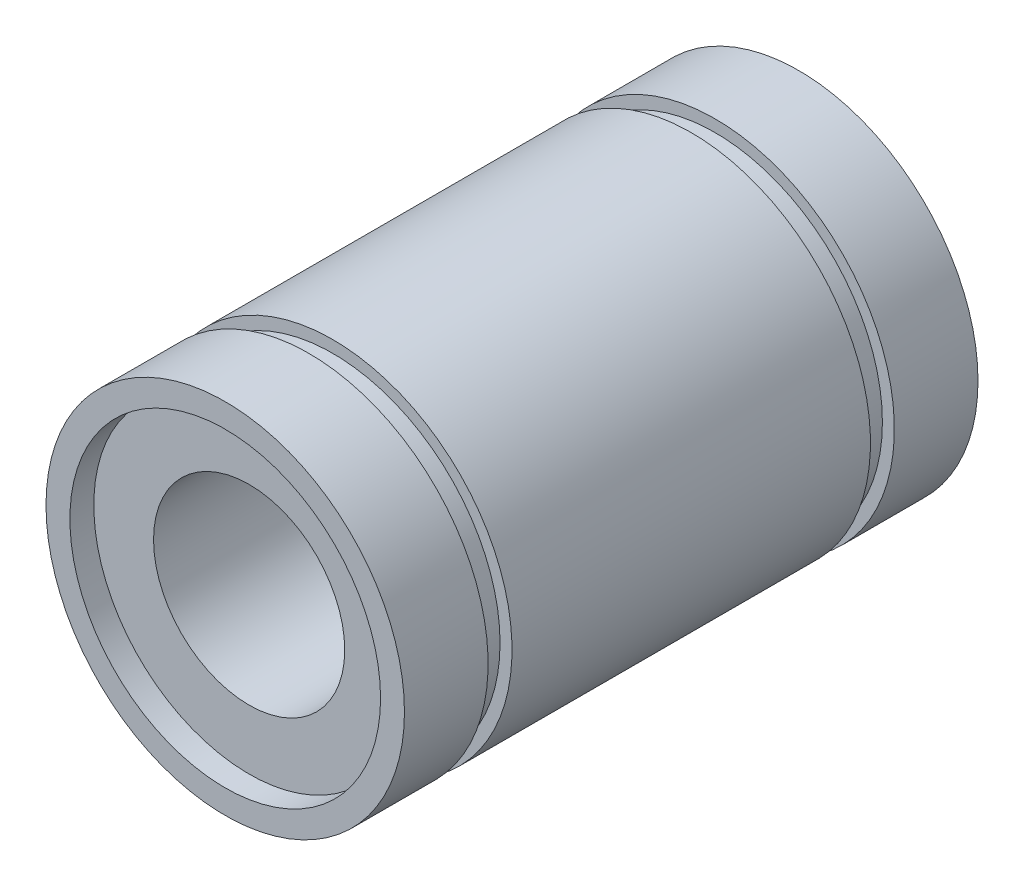
ISO-10303-21;
HEADER;
FILE_DESCRIPTION(('STEP AP214'),'2;1');
FILE_NAME('part.step','',(''),(''),'','','');
FILE_SCHEMA(('AUTOMOTIVE_DESIGN { 1 0 10303 214 1 1 1 1 }'));
ENDSEC;
DATA;
#1=APPLICATION_CONTEXT('core data for automotive mechanical design processes');
#2=APPLICATION_PROTOCOL_DEFINITION('international standard','automotive_design',2000,#1);
#3=PRODUCT_CONTEXT('',#1,'mechanical');
#4=PRODUCT('Part','Part','',(#3));
#5=PRODUCT_RELATED_PRODUCT_CATEGORY('part','',(#4));
#6=PRODUCT_DEFINITION_FORMATION('','',#4);
#7=PRODUCT_DEFINITION_CONTEXT('part definition',#1,'design');
#8=PRODUCT_DEFINITION('design','',#6,#7);
#9=PRODUCT_DEFINITION_SHAPE('','',#8);
#10=(LENGTH_UNIT() NAMED_UNIT(*) SI_UNIT(.MILLI.,.METRE.));
#11=(NAMED_UNIT(*) PLANE_ANGLE_UNIT() SI_UNIT($,.RADIAN.));
#12=(NAMED_UNIT(*) SI_UNIT($,.STERADIAN.) SOLID_ANGLE_UNIT());
#13=UNCERTAINTY_MEASURE_WITH_UNIT(LENGTH_MEASURE(1.E-05),#10,'distance_accuracy_value','');
#14=(GEOMETRIC_REPRESENTATION_CONTEXT(3) GLOBAL_UNCERTAINTY_ASSIGNED_CONTEXT((#13)) GLOBAL_UNIT_ASSIGNED_CONTEXT((#10,
#11,#12)) REPRESENTATION_CONTEXT('',''));
#15=CARTESIAN_POINT('',(0.,0.,0.));
#16=DIRECTION('',(0.,0.,1.));
#17=DIRECTION('',(1.,0.,0.));
#18=AXIS2_PLACEMENT_3D('',#15,#16,#17);
#19=CARTESIAN_POINT('',(0.,0.,11.));
#20=DIRECTION('',(0.,0.,1.));
#21=DIRECTION('',(1.,0.,0.));
#22=AXIS2_PLACEMENT_3D('',#19,#20,#21);
#23=PLANE('',#22);
#24=CARTESIAN_POINT('',(0.,0.,11.));
#25=DIRECTION('',(0.,0.,1.));
#26=DIRECTION('',(1.,0.,0.));
#27=AXIS2_PLACEMENT_3D('',#24,#25,#26);
#28=CIRCLE('',#27,6.5);
#29=CARTESIAN_POINT('',(6.5,0.,11.));
#30=VERTEX_POINT('',#29);
#31=EDGE_CURVE('E11',#30,#30,#28,.T.);
#32=ORIENTED_EDGE('',*,*,#31,.T.);
#33=EDGE_LOOP('',(#32));
#34=FACE_BOUND('',#33,.T.);
#35=CARTESIAN_POINT('',(0.,0.,11.));
#36=DIRECTION('',(0.,0.,1.));
#37=DIRECTION('',(1.,0.,0.));
#38=AXIS2_PLACEMENT_3D('',#35,#36,#37);
#39=CIRCLE('',#38,4.);
#40=CARTESIAN_POINT('',(4.,0.,11.));
#41=VERTEX_POINT('',#40);
#42=EDGE_CURVE('E51',#41,#41,#39,.T.);
#43=ORIENTED_EDGE('',*,*,#42,.F.);
#44=EDGE_LOOP('',(#43));
#45=FACE_BOUND('',#44,.T.);
#46=ADVANCED_FACE('F40',(#34,#45),#23,.T.);
#47=CARTESIAN_POINT('',(0.,0.,-11.));
#48=DIRECTION('',(0.,0.,1.));
#49=DIRECTION('',(1.,0.,0.));
#50=AXIS2_PLACEMENT_3D('',#47,#48,#49);
#51=PLANE('',#50);
#52=CARTESIAN_POINT('',(0.,0.,-11.));
#53=DIRECTION('',(0.,0.,1.));
#54=DIRECTION('',(1.,0.,0.));
#55=AXIS2_PLACEMENT_3D('',#52,#53,#54);
#56=CIRCLE('',#55,6.5);
#57=CARTESIAN_POINT('',(6.5,0.,-11.));
#58=VERTEX_POINT('',#57);
#59=EDGE_CURVE('E44',#58,#58,#56,.T.);
#60=ORIENTED_EDGE('',*,*,#59,.F.);
#61=EDGE_LOOP('',(#60));
#62=FACE_BOUND('',#61,.T.);
#63=CARTESIAN_POINT('',(0.,0.,-11.));
#64=DIRECTION('',(0.,0.,1.));
#65=DIRECTION('',(1.,0.,0.));
#66=AXIS2_PLACEMENT_3D('',#63,#64,#65);
#67=CIRCLE('',#66,4.);
#68=CARTESIAN_POINT('',(4.,0.,-11.));
#69=VERTEX_POINT('',#68);
#70=EDGE_CURVE('E53',#69,#69,#67,.T.);
#71=ORIENTED_EDGE('',*,*,#70,.T.);
#72=EDGE_LOOP('',(#71));
#73=FACE_BOUND('',#72,.T.);
#74=ADVANCED_FACE('F63',(#62,#73),#51,.F.);
#75=CARTESIAN_POINT('',(0.,0.,11.));
#76=DIRECTION('',(0.,0.,-1.));
#77=DIRECTION('',(-1.,0.,0.));
#78=AXIS2_PLACEMENT_3D('',#75,#76,#77);
#79=CYLINDRICAL_SURFACE('',#78,6.5);
#80=ORIENTED_EDGE('',*,*,#31,.F.);
#81=EDGE_LOOP('',(#80));
#82=FACE_BOUND('',#81,.T.);
#83=ORIENTED_EDGE('',*,*,#59,.T.);
#84=EDGE_LOOP('',(#83));
#85=FACE_BOUND('',#84,.T.);
#86=ADVANCED_FACE('F42',(#82,#85),#79,.T.);
#87=CARTESIAN_POINT('',(0.,0.,11.));
#88=DIRECTION('',(0.,0.,-1.));
#89=DIRECTION('',(-1.,0.,0.));
#90=AXIS2_PLACEMENT_3D('',#87,#88,#89);
#91=CYLINDRICAL_SURFACE('',#90,4.);
#92=ORIENTED_EDGE('',*,*,#42,.T.);
#93=EDGE_LOOP('',(#92));
#94=FACE_BOUND('',#93,.T.);
#95=ORIENTED_EDGE('',*,*,#70,.F.);
#96=EDGE_LOOP('',(#95));
#97=FACE_BOUND('',#96,.T.);
#98=ADVANCED_FACE('F59',(#94,#97),#91,.F.);
#99=CLOSED_SHELL('',(#46,#74,#86,#98));
#100=MANIFOLD_SOLID_BREP('B2',#99);
#101=CARTESIAN_POINT('',(0.,0.,12.));
#102=DIRECTION('',(0.,0.,-1.));
#103=DIRECTION('',(-1.,0.,0.));
#104=AXIS2_PLACEMENT_3D('',#101,#102,#103);
#105=CYLINDRICAL_SURFACE('',#104,7.5);
#106=CARTESIAN_POINT('',(0.,0.,12.));
#107=DIRECTION('',(0.,0.,1.));
#108=DIRECTION('',(1.,0.,0.));
#109=AXIS2_PLACEMENT_3D('',#106,#107,#108);
#110=CIRCLE('',#109,7.5);
#111=CARTESIAN_POINT('',(7.5,0.,12.));
#112=VERTEX_POINT('',#111);
#113=EDGE_CURVE('E39',#112,#112,#110,.T.);
#114=ORIENTED_EDGE('',*,*,#113,.F.);
#115=EDGE_LOOP('',(#114));
#116=FACE_BOUND('',#115,.T.);
#117=CARTESIAN_POINT('',(0.,0.,8.5));
#118=DIRECTION('',(0.,0.,-1.));
#119=DIRECTION('',(-1.,0.,0.));
#120=AXIS2_PLACEMENT_3D('',#117,#118,#119);
#121=CIRCLE('',#120,7.5);
#122=CARTESIAN_POINT('',(-7.5,0.,8.5));
#123=VERTEX_POINT('',#122);
#124=EDGE_CURVE('E139',#123,#123,#121,.T.);
#125=ORIENTED_EDGE('',*,*,#124,.F.);
#126=EDGE_LOOP('',(#125));
#127=FACE_BOUND('',#126,.T.);
#128=ADVANCED_FACE('F101',(#116,#127),#105,.T.);
#129=CARTESIAN_POINT('',(0.,0.,-7.5));
#130=DIRECTION('',(0.,0.,-1.));
#131=DIRECTION('',(-1.,0.,0.));
#132=AXIS2_PLACEMENT_3D('',#129,#130,#131);
#133=CIRCLE('',#132,7.5);
#134=CARTESIAN_POINT('',(-7.5,0.,-7.5));
#135=VERTEX_POINT('',#134);
#136=EDGE_CURVE('E116',#135,#135,#133,.T.);
#137=ORIENTED_EDGE('',*,*,#136,.F.);
#138=EDGE_LOOP('',(#137));
#139=FACE_BOUND('',#138,.T.);
#140=CARTESIAN_POINT('',(0.,0.,7.5));
#141=DIRECTION('',(0.,0.,-1.));
#142=DIRECTION('',(-1.,0.,0.));
#143=AXIS2_PLACEMENT_3D('',#140,#141,#142);
#144=CIRCLE('',#143,7.5);
#145=CARTESIAN_POINT('',(-7.5,0.,7.5));
#146=VERTEX_POINT('',#145);
#147=EDGE_CURVE('E136',#146,#146,#144,.T.);
#148=ORIENTED_EDGE('',*,*,#147,.T.);
#149=EDGE_LOOP('',(#148));
#150=FACE_BOUND('',#149,.T.);
#151=ADVANCED_FACE('F147',(#139,#150),#105,.T.);
#152=CARTESIAN_POINT('',(0.,0.,-12.));
#153=DIRECTION('',(0.,0.,1.));
#154=DIRECTION('',(1.,0.,0.));
#155=AXIS2_PLACEMENT_3D('',#152,#153,#154);
#156=CIRCLE('',#155,7.5);
#157=CARTESIAN_POINT('',(7.5,0.,-12.));
#158=VERTEX_POINT('',#157);
#159=EDGE_CURVE('E104',#158,#158,#156,.T.);
#160=ORIENTED_EDGE('',*,*,#159,.T.);
#161=EDGE_LOOP('',(#160));
#162=FACE_BOUND('',#161,.T.);
#163=CARTESIAN_POINT('',(0.,0.,-8.5));
#164=DIRECTION('',(0.,0.,-1.));
#165=DIRECTION('',(-1.,0.,0.));
#166=AXIS2_PLACEMENT_3D('',#163,#164,#165);
#167=CIRCLE('',#166,7.5);
#168=CARTESIAN_POINT('',(-7.5,0.,-8.5));
#169=VERTEX_POINT('',#168);
#170=EDGE_CURVE('E127',#169,#169,#167,.T.);
#171=ORIENTED_EDGE('',*,*,#170,.T.);
#172=EDGE_LOOP('',(#171));
#173=FACE_BOUND('',#172,.T.);
#174=ADVANCED_FACE('F149',(#162,#173),#105,.T.);
#175=CARTESIAN_POINT('',(0.,0.,12.));
#176=DIRECTION('',(0.,0.,1.));
#177=DIRECTION('',(1.,0.,0.));
#178=AXIS2_PLACEMENT_3D('',#175,#176,#177);
#179=PLANE('',#178);
#180=ORIENTED_EDGE('',*,*,#113,.T.);
#181=EDGE_LOOP('',(#180));
#182=FACE_BOUND('',#181,.T.);
#183=CARTESIAN_POINT('',(0.,0.,12.));
#184=DIRECTION('',(0.,0.,1.));
#185=DIRECTION('',(1.,0.,0.));
#186=AXIS2_PLACEMENT_3D('',#183,#184,#185);
#187=CIRCLE('',#186,6.5);
#188=CARTESIAN_POINT('',(6.5,0.,12.));
#189=VERTEX_POINT('',#188);
#190=EDGE_CURVE('E111',#189,#189,#187,.T.);
#191=ORIENTED_EDGE('',*,*,#190,.F.);
#192=EDGE_LOOP('',(#191));
#193=FACE_BOUND('',#192,.T.);
#194=ADVANCED_FACE('F155',(#182,#193),#179,.T.);
#195=CARTESIAN_POINT('',(0.,0.,-12.));
#196=DIRECTION('',(0.,0.,1.));
#197=DIRECTION('',(1.,0.,0.));
#198=AXIS2_PLACEMENT_3D('',#195,#196,#197);
#199=PLANE('',#198);
#200=ORIENTED_EDGE('',*,*,#159,.F.);
#201=EDGE_LOOP('',(#200));
#202=FACE_BOUND('',#201,.T.);
#203=CARTESIAN_POINT('',(0.,0.,-12.));
#204=DIRECTION('',(0.,0.,1.));
#205=DIRECTION('',(1.,0.,0.));
#206=AXIS2_PLACEMENT_3D('',#203,#204,#205);
#207=CIRCLE('',#206,6.5);
#208=CARTESIAN_POINT('',(6.5,0.,-12.));
#209=VERTEX_POINT('',#208);
#210=EDGE_CURVE('E113',#209,#209,#207,.T.);
#211=ORIENTED_EDGE('',*,*,#210,.T.);
#212=EDGE_LOOP('',(#211));
#213=FACE_BOUND('',#212,.T.);
#214=ADVANCED_FACE('F160',(#202,#213),#199,.F.);
#215=CARTESIAN_POINT('',(0.,0.,12.));
#216=DIRECTION('',(0.,0.,-1.));
#217=DIRECTION('',(-1.,0.,0.));
#218=AXIS2_PLACEMENT_3D('',#215,#216,#217);
#219=CYLINDRICAL_SURFACE('',#218,6.5);
#220=ORIENTED_EDGE('',*,*,#190,.T.);
#221=EDGE_LOOP('',(#220));
#222=FACE_BOUND('',#221,.T.);
#223=ORIENTED_EDGE('',*,*,#210,.F.);
#224=EDGE_LOOP('',(#223));
#225=FACE_BOUND('',#224,.T.);
#226=ADVANCED_FACE('F184',(#222,#225),#219,.F.);
#227=CARTESIAN_POINT('',(7.5,0.,-7.5));
#228=DIRECTION('',(0.,0.,-1.));
#229=DIRECTION('',(-1.,0.,0.));
#230=AXIS2_PLACEMENT_3D('',#227,#228,#229);
#231=PLANE('',#230);
#232=ORIENTED_EDGE('',*,*,#136,.T.);
#233=EDGE_LOOP('',(#232));
#234=FACE_BOUND('',#233,.T.);
#235=CARTESIAN_POINT('',(0.,0.,-7.5));
#236=DIRECTION('',(0.,0.,-1.));
#237=DIRECTION('',(-1.,0.,0.));
#238=AXIS2_PLACEMENT_3D('',#235,#236,#237);
#239=CIRCLE('',#238,7.);
#240=CARTESIAN_POINT('',(-7.,0.,-7.5));
#241=VERTEX_POINT('',#240);
#242=EDGE_CURVE('E121',#241,#241,#239,.T.);
#243=ORIENTED_EDGE('',*,*,#242,.F.);
#244=EDGE_LOOP('',(#243));
#245=FACE_BOUND('',#244,.T.);
#246=ADVANCED_FACE('F177',(#234,#245),#231,.T.);
#247=CARTESIAN_POINT('',(0.,0.,-12.));
#248=DIRECTION('',(0.,0.,-1.));
#249=DIRECTION('',(-1.,0.,0.));
#250=AXIS2_PLACEMENT_3D('',#247,#248,#249);
#251=CYLINDRICAL_SURFACE('',#250,7.);
#252=ORIENTED_EDGE('',*,*,#242,.T.);
#253=EDGE_LOOP('',(#252));
#254=FACE_BOUND('',#253,.T.);
#255=CARTESIAN_POINT('',(0.,0.,-8.5));
#256=DIRECTION('',(0.,0.,-1.));
#257=DIRECTION('',(-1.,0.,0.));
#258=AXIS2_PLACEMENT_3D('',#255,#256,#257);
#259=CIRCLE('',#258,7.);
#260=CARTESIAN_POINT('',(-7.,0.,-8.5));
#261=VERTEX_POINT('',#260);
#262=EDGE_CURVE('E124',#261,#261,#259,.T.);
#263=ORIENTED_EDGE('',*,*,#262,.F.);
#264=EDGE_LOOP('',(#263));
#265=FACE_BOUND('',#264,.T.);
#266=ADVANCED_FACE('F168',(#254,#265),#251,.T.);
#267=CARTESIAN_POINT('',(7.5,0.,-8.5));
#268=DIRECTION('',(0.,0.,1.));
#269=DIRECTION('',(1.,0.,0.));
#270=AXIS2_PLACEMENT_3D('',#267,#268,#269);
#271=PLANE('',#270);
#272=ORIENTED_EDGE('',*,*,#262,.T.);
#273=EDGE_LOOP('',(#272));
#274=FACE_BOUND('',#273,.T.);
#275=ORIENTED_EDGE('',*,*,#170,.F.);
#276=EDGE_LOOP('',(#275));
#277=FACE_BOUND('',#276,.T.);
#278=ADVANCED_FACE('F166',(#274,#277),#271,.T.);
#279=CARTESIAN_POINT('',(7.5,0.,8.5));
#280=DIRECTION('',(0.,0.,-1.));
#281=DIRECTION('',(-1.,0.,0.));
#282=AXIS2_PLACEMENT_3D('',#279,#280,#281);
#283=PLANE('',#282);
#284=ORIENTED_EDGE('',*,*,#124,.T.);
#285=EDGE_LOOP('',(#284));
#286=FACE_BOUND('',#285,.T.);
#287=CARTESIAN_POINT('',(0.,0.,8.5));
#288=DIRECTION('',(0.,0.,-1.));
#289=DIRECTION('',(-1.,0.,0.));
#290=AXIS2_PLACEMENT_3D('',#287,#288,#289);
#291=CIRCLE('',#290,7.);
#292=CARTESIAN_POINT('',(-7.,0.,8.5));
#293=VERTEX_POINT('',#292);
#294=EDGE_CURVE('E130',#293,#293,#291,.T.);
#295=ORIENTED_EDGE('',*,*,#294,.F.);
#296=EDGE_LOOP('',(#295));
#297=FACE_BOUND('',#296,.T.);
#298=ADVANCED_FACE('F143',(#286,#297),#283,.T.);
#299=CARTESIAN_POINT('',(0.,0.,-12.));
#300=DIRECTION('',(0.,0.,-1.));
#301=DIRECTION('',(-1.,0.,0.));
#302=AXIS2_PLACEMENT_3D('',#299,#300,#301);
#303=CYLINDRICAL_SURFACE('',#302,7.);
#304=ORIENTED_EDGE('',*,*,#294,.T.);
#305=EDGE_LOOP('',(#304));
#306=FACE_BOUND('',#305,.T.);
#307=CARTESIAN_POINT('',(0.,0.,7.5));
#308=DIRECTION('',(0.,0.,-1.));
#309=DIRECTION('',(-1.,0.,0.));
#310=AXIS2_PLACEMENT_3D('',#307,#308,#309);
#311=CIRCLE('',#310,7.);
#312=CARTESIAN_POINT('',(-7.,0.,7.5));
#313=VERTEX_POINT('',#312);
#314=EDGE_CURVE('E133',#313,#313,#311,.T.);
#315=ORIENTED_EDGE('',*,*,#314,.F.);
#316=EDGE_LOOP('',(#315));
#317=FACE_BOUND('',#316,.T.);
#318=ADVANCED_FACE('F175',(#306,#317),#303,.T.);
#319=CARTESIAN_POINT('',(7.5,0.,7.5));
#320=DIRECTION('',(0.,0.,1.));
#321=DIRECTION('',(1.,0.,0.));
#322=AXIS2_PLACEMENT_3D('',#319,#320,#321);
#323=PLANE('',#322);
#324=ORIENTED_EDGE('',*,*,#314,.T.);
#325=EDGE_LOOP('',(#324));
#326=FACE_BOUND('',#325,.T.);
#327=ORIENTED_EDGE('',*,*,#147,.F.);
#328=EDGE_LOOP('',(#327));
#329=FACE_BOUND('',#328,.T.);
#330=ADVANCED_FACE('F228',(#326,#329),#323,.T.);
#331=CLOSED_SHELL('',(#128,#151,#174,#194,#214,#226,#246,#266,#278,#298,#318,#330));
#332=MANIFOLD_SOLID_BREP('B6',#331);
#333=ADVANCED_BREP_SHAPE_REPRESENTATION('',(#18,#100,#332),#14);
#334=SHAPE_DEFINITION_REPRESENTATION(#9,#333);
ENDSEC;
END-ISO-10303-21;
